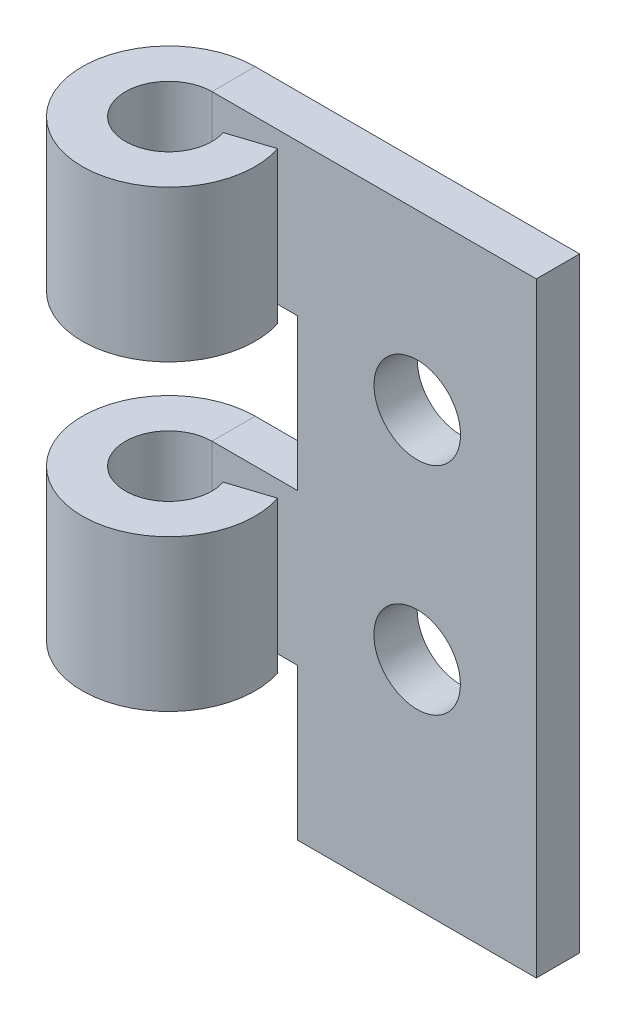
ISO-10303-21;
HEADER;
FILE_DESCRIPTION(('STEP AP214'),'2;1');
FILE_NAME('part.step','',(''),(''),'','','');
FILE_SCHEMA(('AUTOMOTIVE_DESIGN { 1 0 10303 214 1 1 1 1 }'));
ENDSEC;
DATA;
#1=APPLICATION_CONTEXT('core data for automotive mechanical design processes');
#2=APPLICATION_PROTOCOL_DEFINITION('international standard','automotive_design',2000,#1);
#3=PRODUCT_CONTEXT('',#1,'mechanical');
#4=PRODUCT('Part','Part','',(#3));
#5=PRODUCT_RELATED_PRODUCT_CATEGORY('part','',(#4));
#6=PRODUCT_DEFINITION_FORMATION('','',#4);
#7=PRODUCT_DEFINITION_CONTEXT('part definition',#1,'design');
#8=PRODUCT_DEFINITION('design','',#6,#7);
#9=PRODUCT_DEFINITION_SHAPE('','',#8);
#10=(LENGTH_UNIT() NAMED_UNIT(*) SI_UNIT(.MILLI.,.METRE.));
#11=(NAMED_UNIT(*) PLANE_ANGLE_UNIT() SI_UNIT($,.RADIAN.));
#12=(NAMED_UNIT(*) SI_UNIT($,.STERADIAN.) SOLID_ANGLE_UNIT());
#13=UNCERTAINTY_MEASURE_WITH_UNIT(LENGTH_MEASURE(1.E-05),#10,'distance_accuracy_value','');
#14=(GEOMETRIC_REPRESENTATION_CONTEXT(3) GLOBAL_UNCERTAINTY_ASSIGNED_CONTEXT((#13)) GLOBAL_UNIT_ASSIGNED_CONTEXT((#10,
#11,#12)) REPRESENTATION_CONTEXT('',''));
#15=CARTESIAN_POINT('',(0.,0.,0.));
#16=DIRECTION('',(0.,0.,1.));
#17=DIRECTION('',(1.,0.,0.));
#18=AXIS2_PLACEMENT_3D('',#15,#16,#17);
#19=CARTESIAN_POINT('',(-74.2525744057773,-0.875786914341309,1.));
#20=DIRECTION('',(-1.,0.,0.));
#21=DIRECTION('',(0.,0.,1.));
#22=AXIS2_PLACEMENT_3D('',#19,#20,#21);
#23=PLANE('',#22);
#24=DIRECTION('',(0.,1.,0.));
#25=VECTOR('',#24,1.);
#26=CARTESIAN_POINT('',(-74.2525744057773,-0.875786914341309,0.));
#27=LINE('',#26,#25);
#28=CARTESIAN_POINT('',(-74.2525744057773,-14.8757869143413,0.));
#29=VERTEX_POINT('',#28);
#30=CARTESIAN_POINT('',(-74.2525744057773,-0.875786914341309,0.));
#31=VERTEX_POINT('',#30);
#32=EDGE_CURVE('E106',#29,#31,#27,.T.);
#33=ORIENTED_EDGE('',*,*,#32,.T.);
#34=DIRECTION('',(0.,0.,-1.));
#35=VECTOR('',#34,1.);
#36=CARTESIAN_POINT('',(-74.2525744057773,-0.875786914341309,1.));
#37=LINE('',#36,#35);
#38=CARTESIAN_POINT('',(-74.2525744057773,-0.875786914341309,1.));
#39=VERTEX_POINT('',#38);
#40=EDGE_CURVE('E11',#39,#31,#37,.T.);
#41=ORIENTED_EDGE('',*,*,#40,.F.);
#42=DIRECTION('',(0.,1.,0.));
#43=VECTOR('',#42,1.);
#44=CARTESIAN_POINT('',(-74.2525744057773,-0.875786914341309,1.));
#45=LINE('',#44,#43);
#46=CARTESIAN_POINT('',(-74.2525744057773,-14.8757869143413,1.));
#47=VERTEX_POINT('',#46);
#48=EDGE_CURVE('E129',#47,#39,#45,.T.);
#49=ORIENTED_EDGE('',*,*,#48,.F.);
#50=DIRECTION('',(0.,0.,-1.));
#51=VECTOR('',#50,1.);
#52=CARTESIAN_POINT('',(-74.2525744057773,-14.8757869143413,1.));
#53=LINE('',#52,#51);
#54=EDGE_CURVE('E138',#47,#29,#53,.T.);
#55=ORIENTED_EDGE('',*,*,#54,.T.);
#56=EDGE_LOOP('',(#33,#41,#49,#55));
#57=FACE_BOUND('',#56,.T.);
#58=ADVANCED_FACE('F37',(#57),#23,.F.);
#59=CARTESIAN_POINT('',(-74.2525744057773,-0.875786914341309,1.));
#60=DIRECTION('',(0.,-1.,0.));
#61=DIRECTION('',(1.,0.,0.));
#62=AXIS2_PLACEMENT_3D('',#59,#60,#61);
#63=PLANE('',#62);
#64=DIRECTION('',(-1.,0.,0.));
#65=VECTOR('',#64,1.);
#66=CARTESIAN_POINT('',(-74.2525744057773,-0.875786914341309,0.));
#67=LINE('',#66,#65);
#68=CARTESIAN_POINT('',(-81.7525744057774,-0.87578691434131,0.));
#69=VERTEX_POINT('',#68);
#70=EDGE_CURVE('E65',#31,#69,#67,.T.);
#71=ORIENTED_EDGE('',*,*,#70,.T.);
#72=DIRECTION('',(0.,0.,-1.));
#73=VECTOR('',#72,1.);
#74=CARTESIAN_POINT('',(-81.7525744057774,-0.87578691434131,1.));
#75=LINE('',#74,#73);
#76=CARTESIAN_POINT('',(-81.7525744057774,-0.87578691434131,0.999999999999999));
#77=VERTEX_POINT('',#76);
#78=EDGE_CURVE('E45',#77,#69,#75,.T.);
#79=ORIENTED_EDGE('',*,*,#78,.F.);
#80=DIRECTION('',(-1.,0.,0.));
#81=VECTOR('',#80,1.);
#82=CARTESIAN_POINT('',(-74.2525744057773,-0.875786914341309,1.));
#83=LINE('',#82,#81);
#84=EDGE_CURVE('E131',#39,#77,#83,.T.);
#85=ORIENTED_EDGE('',*,*,#84,.F.);
#86=ORIENTED_EDGE('',*,*,#40,.T.);
#87=EDGE_LOOP('',(#71,#79,#85,#86));
#88=FACE_BOUND('',#87,.T.);
#89=ADVANCED_FACE('F324',(#88),#63,.F.);
#90=CARTESIAN_POINT('',(-74.2525744057773,-14.8757869143413,1.));
#91=DIRECTION('',(0.,1.,0.));
#92=DIRECTION('',(0.,0.,1.));
#93=AXIS2_PLACEMENT_3D('',#90,#91,#92);
#94=PLANE('',#93);
#95=DIRECTION('',(1.,0.,0.));
#96=VECTOR('',#95,1.);
#97=CARTESIAN_POINT('',(-74.2525744057773,-14.8757869143413,1.));
#98=LINE('',#97,#96);
#99=CARTESIAN_POINT('',(-79.7716026867718,-14.8757869143413,1.));
#100=VERTEX_POINT('',#99);
#101=EDGE_CURVE('E53',#100,#47,#98,.T.);
#102=ORIENTED_EDGE('',*,*,#101,.F.);
#103=DIRECTION('',(0.,0.,1.));
#104=VECTOR('',#103,1.);
#105=CARTESIAN_POINT('',(-79.7716026867718,-14.8757869143413,-0.00100000000000078));
#106=LINE('',#105,#104);
#107=CARTESIAN_POINT('',(-79.7716026867718,-14.8757869143413,0.));
#108=VERTEX_POINT('',#107);
#109=EDGE_CURVE('E166',#108,#100,#106,.T.);
#110=ORIENTED_EDGE('',*,*,#109,.F.);
#111=DIRECTION('',(1.,0.,0.));
#112=VECTOR('',#111,1.);
#113=CARTESIAN_POINT('',(-74.2525744057773,-14.8757869143413,0.));
#114=LINE('',#113,#112);
#115=EDGE_CURVE('E132',#108,#29,#114,.T.);
#116=ORIENTED_EDGE('',*,*,#115,.T.);
#117=ORIENTED_EDGE('',*,*,#54,.F.);
#118=EDGE_LOOP('',(#102,#110,#116,#117));
#119=FACE_BOUND('',#118,.T.);
#120=ADVANCED_FACE('F164',(#119),#94,.F.);
#121=CARTESIAN_POINT('',(0.,0.,1.));
#122=DIRECTION('',(0.,0.,-1.));
#123=DIRECTION('',(-1.,0.,0.));
#124=AXIS2_PLACEMENT_3D('',#121,#122,#123);
#125=PLANE('',#124);
#126=CARTESIAN_POINT('',(-77.0052927316337,-4.87578691434131,1.));
#127=DIRECTION('',(0.,0.,1.));
#128=DIRECTION('',(1.,0.,0.));
#129=AXIS2_PLACEMENT_3D('',#126,#127,#128);
#130=CIRCLE('',#129,0.999999999999998);
#131=CARTESIAN_POINT('',(-76.0052927316337,-4.87578691434131,1.));
#132=VERTEX_POINT('',#131);
#133=EDGE_CURVE('E251',#132,#132,#130,.T.);
#134=ORIENTED_EDGE('',*,*,#133,.F.);
#135=EDGE_LOOP('',(#134));
#136=FACE_BOUND('',#135,.T.);
#137=CARTESIAN_POINT('',(-77.0086906389541,-9.87578691434131,1.));
#138=DIRECTION('',(0.,0.,1.));
#139=DIRECTION('',(1.,0.,0.));
#140=AXIS2_PLACEMENT_3D('',#137,#138,#139);
#141=CIRCLE('',#140,0.999999999999998);
#142=CARTESIAN_POINT('',(-76.0086906389541,-9.87578691434131,1.));
#143=VERTEX_POINT('',#142);
#144=EDGE_CURVE('E549',#143,#143,#141,.T.);
#145=ORIENTED_EDGE('',*,*,#144,.F.);
#146=EDGE_LOOP('',(#145));
#147=FACE_BOUND('',#146,.T.);
#148=DIRECTION('',(0.,-1.,0.));
#149=VECTOR('',#148,1.);
#150=CARTESIAN_POINT('',(-81.7525744057774,-0.87578691434131,1.));
#151=LINE('',#150,#149);
#152=CARTESIAN_POINT('',(-81.7525744057774,-4.37578691434131,1.));
#153=VERTEX_POINT('',#152);
#154=EDGE_CURVE('E135',#77,#153,#151,.T.);
#155=ORIENTED_EDGE('',*,*,#154,.T.);
#156=DIRECTION('',(-1.,0.,0.));
#157=VECTOR('',#156,1.);
#158=CARTESIAN_POINT('',(-81.7525744057774,-4.37578691434131,1.));
#159=LINE('',#158,#157);
#160=CARTESIAN_POINT('',(-79.7716026867718,-4.37578691434131,1.));
#161=VERTEX_POINT('',#160);
#162=EDGE_CURVE('E240',#161,#153,#159,.T.);
#163=ORIENTED_EDGE('',*,*,#162,.F.);
#164=DIRECTION('',(0.,1.,0.));
#165=VECTOR('',#164,1.);
#166=CARTESIAN_POINT('',(-79.7716026867718,-4.37578691434131,1.));
#167=LINE('',#166,#165);
#168=CARTESIAN_POINT('',(-79.7716026867718,-7.87578691434131,1.));
#169=VERTEX_POINT('',#168);
#170=EDGE_CURVE('E233',#169,#161,#167,.T.);
#171=ORIENTED_EDGE('',*,*,#170,.F.);
#172=DIRECTION('',(1.,0.,0.));
#173=VECTOR('',#172,1.);
#174=CARTESIAN_POINT('',(-81.7525744057774,-7.87578691434131,1.));
#175=LINE('',#174,#173);
#176=CARTESIAN_POINT('',(-81.7525744057774,-7.87578691434131,1.));
#177=VERTEX_POINT('',#176);
#178=EDGE_CURVE('E230',#177,#169,#175,.T.);
#179=ORIENTED_EDGE('',*,*,#178,.F.);
#180=DIRECTION('',(0.,-1.,0.));
#181=VECTOR('',#180,1.);
#182=CARTESIAN_POINT('',(-81.7525744057774,-11.3757869143413,1.));
#183=LINE('',#182,#181);
#184=CARTESIAN_POINT('',(-81.7525744057774,-11.3757869143413,1.));
#185=VERTEX_POINT('',#184);
#186=EDGE_CURVE('E196',#185,#177,#183,.F.);
#187=ORIENTED_EDGE('',*,*,#186,.F.);
#188=DIRECTION('',(-1.,0.,0.));
#189=VECTOR('',#188,1.);
#190=CARTESIAN_POINT('',(-81.7525744057774,-11.3757869143413,1.));
#191=LINE('',#190,#189);
#192=CARTESIAN_POINT('',(-79.7716026867718,-11.3757869143413,1.));
#193=VERTEX_POINT('',#192);
#194=EDGE_CURVE('E171',#193,#185,#191,.T.);
#195=ORIENTED_EDGE('',*,*,#194,.F.);
#196=DIRECTION('',(0.,1.,0.));
#197=VECTOR('',#196,1.);
#198=CARTESIAN_POINT('',(-79.7716026867718,-11.3757869143413,1.));
#199=LINE('',#198,#197);
#200=EDGE_CURVE('E177',#100,#193,#199,.T.);
#201=ORIENTED_EDGE('',*,*,#200,.F.);
#202=ORIENTED_EDGE('',*,*,#101,.T.);
#203=ORIENTED_EDGE('',*,*,#48,.T.);
#204=ORIENTED_EDGE('',*,*,#84,.T.);
#205=EDGE_LOOP('',(#155,#163,#171,#179,#187,#195,#201,#202,#203,#204));
#206=FACE_BOUND('',#205,.T.);
#207=ADVANCED_FACE('F258',(#136,#147,#206),#125,.F.);
#208=CARTESIAN_POINT('',(0.,0.,0.));
#209=DIRECTION('',(0.,0.,-1.));
#210=DIRECTION('',(-1.,0.,0.));
#211=AXIS2_PLACEMENT_3D('',#208,#209,#210);
#212=PLANE('',#211);
#213=CARTESIAN_POINT('',(-77.0052927316337,-4.87578691434131,0.));
#214=DIRECTION('',(0.,0.,-1.));
#215=DIRECTION('',(-1.,0.,0.));
#216=AXIS2_PLACEMENT_3D('',#213,#214,#215);
#217=CIRCLE('',#216,0.999999999999998);
#218=CARTESIAN_POINT('',(-78.0052927316337,-4.87578691434131,0.));
#219=VERTEX_POINT('',#218);
#220=EDGE_CURVE('E545',#219,#219,#217,.F.);
#221=ORIENTED_EDGE('',*,*,#220,.T.);
#222=EDGE_LOOP('',(#221));
#223=FACE_BOUND('',#222,.T.);
#224=CARTESIAN_POINT('',(-77.0086906389541,-9.87578691434131,0.));
#225=DIRECTION('',(0.,0.,-1.));
#226=DIRECTION('',(-1.,0.,0.));
#227=AXIS2_PLACEMENT_3D('',#224,#225,#226);
#228=CIRCLE('',#227,0.999999999999998);
#229=CARTESIAN_POINT('',(-78.0086906389541,-9.87578691434131,0.));
#230=VERTEX_POINT('',#229);
#231=EDGE_CURVE('E553',#230,#230,#228,.F.);
#232=ORIENTED_EDGE('',*,*,#231,.T.);
#233=EDGE_LOOP('',(#232));
#234=FACE_BOUND('',#233,.T.);
#235=DIRECTION('',(-1.,0.,0.));
#236=VECTOR('',#235,1.);
#237=CARTESIAN_POINT('',(-81.7525744057774,-4.37578691434131,0.));
#238=LINE('',#237,#236);
#239=CARTESIAN_POINT('',(-79.7716026867718,-4.37578691434131,0.));
#240=VERTEX_POINT('',#239);
#241=CARTESIAN_POINT('',(-81.7525744057774,-4.37578691434131,0.));
#242=VERTEX_POINT('',#241);
#243=EDGE_CURVE('E224',#240,#242,#238,.T.);
#244=ORIENTED_EDGE('',*,*,#243,.T.);
#245=DIRECTION('',(0.,-1.,0.));
#246=VECTOR('',#245,1.);
#247=CARTESIAN_POINT('',(-81.7525744057774,-0.87578691434131,0.));
#248=LINE('',#247,#246);
#249=EDGE_CURVE('E142',#69,#242,#248,.T.);
#250=ORIENTED_EDGE('',*,*,#249,.F.);
#251=ORIENTED_EDGE('',*,*,#70,.F.);
#252=ORIENTED_EDGE('',*,*,#32,.F.);
#253=ORIENTED_EDGE('',*,*,#115,.F.);
#254=DIRECTION('',(0.,1.,0.));
#255=VECTOR('',#254,1.);
#256=CARTESIAN_POINT('',(-79.7716026867718,-11.3757869143413,0.));
#257=LINE('',#256,#255);
#258=CARTESIAN_POINT('',(-79.7716026867718,-11.3757869143413,0.));
#259=VERTEX_POINT('',#258);
#260=EDGE_CURVE('E159',#108,#259,#257,.T.);
#261=ORIENTED_EDGE('',*,*,#260,.T.);
#262=DIRECTION('',(-1.,0.,0.));
#263=VECTOR('',#262,1.);
#264=CARTESIAN_POINT('',(-81.7525744057774,-11.3757869143413,0.));
#265=LINE('',#264,#263);
#266=CARTESIAN_POINT('',(-81.7525744057774,-11.3757869143413,0.));
#267=VERTEX_POINT('',#266);
#268=EDGE_CURVE('E250',#259,#267,#265,.T.);
#269=ORIENTED_EDGE('',*,*,#268,.T.);
#270=DIRECTION('',(0.,-1.,0.));
#271=VECTOR('',#270,1.);
#272=CARTESIAN_POINT('',(-81.7525744057774,-11.3757869143413,0.));
#273=LINE('',#272,#271);
#274=CARTESIAN_POINT('',(-81.7525744057774,-7.87578691434131,0.));
#275=VERTEX_POINT('',#274);
#276=EDGE_CURVE('E180',#267,#275,#273,.F.);
#277=ORIENTED_EDGE('',*,*,#276,.T.);
#278=DIRECTION('',(1.,0.,0.));
#279=VECTOR('',#278,1.);
#280=CARTESIAN_POINT('',(-81.7525744057774,-7.87578691434131,0.));
#281=LINE('',#280,#279);
#282=CARTESIAN_POINT('',(-79.7716026867718,-7.87578691434131,0.));
#283=VERTEX_POINT('',#282);
#284=EDGE_CURVE('E205',#275,#283,#281,.T.);
#285=ORIENTED_EDGE('',*,*,#284,.T.);
#286=DIRECTION('',(0.,1.,0.));
#287=VECTOR('',#286,1.);
#288=CARTESIAN_POINT('',(-79.7716026867718,-4.37578691434131,0.));
#289=LINE('',#288,#287);
#290=EDGE_CURVE('E174',#283,#240,#289,.T.);
#291=ORIENTED_EDGE('',*,*,#290,.T.);
#292=EDGE_LOOP('',(#244,#250,#251,#252,#253,#261,#269,#277,#285,#291));
#293=FACE_BOUND('',#292,.T.);
#294=ADVANCED_FACE('F153',(#223,#234,#293),#212,.T.);
#295=CARTESIAN_POINT('',(-80.8015178894822,-2.62578691434131,1.69098300562504));
#296=DIRECTION('',(0.309016994374958,0.,0.95105651629515));
#297=DIRECTION('',(0.,-1.,0.));
#298=AXIS2_PLACEMENT_3D('',#295,#296,#297);
#299=PLANE('',#298);
#300=DIRECTION('',(0.95105651629515,0.,-0.309016994374958));
#301=VECTOR('',#300,1.);
#302=CARTESIAN_POINT('',(-80.8015178894822,-4.37578691434131,1.69098300562504));
#303=LINE('',#302,#301);
#304=CARTESIAN_POINT('',(-80.8015178894822,-4.37578691434131,1.69098300562504));
#305=VERTEX_POINT('',#304);
#306=CARTESIAN_POINT('',(-79.850461373187,-4.37578691434131,1.38196601125008));
#307=VERTEX_POINT('',#306);
#308=EDGE_CURVE('E95',#305,#307,#303,.T.);
#309=ORIENTED_EDGE('',*,*,#308,.F.);
#310=DIRECTION('',(0.,-1.,0.));
#311=VECTOR('',#310,1.);
#312=CARTESIAN_POINT('',(-80.8015178894822,-4.37578691434131,1.69098300562504));
#313=LINE('',#312,#311);
#314=CARTESIAN_POINT('',(-80.8015178894822,-0.87578691434131,1.69098300562504));
#315=VERTEX_POINT('',#314);
#316=EDGE_CURVE('E98',#315,#305,#313,.T.);
#317=ORIENTED_EDGE('',*,*,#316,.F.);
#318=DIRECTION('',(0.95105651629515,0.,-0.309016994374958));
#319=VECTOR('',#318,1.);
#320=CARTESIAN_POINT('',(-80.8015178894822,-0.87578691434131,1.69098300562504));
#321=LINE('',#320,#319);
#322=CARTESIAN_POINT('',(-79.850461373187,-0.87578691434131,1.38196601125008));
#323=VERTEX_POINT('',#322);
#324=EDGE_CURVE('E107',#315,#323,#321,.T.);
#325=ORIENTED_EDGE('',*,*,#324,.T.);
#326=DIRECTION('',(0.,-1.,0.));
#327=VECTOR('',#326,1.);
#328=CARTESIAN_POINT('',(-79.850461373187,-4.37578691434131,1.38196601125008));
#329=LINE('',#328,#327);
#330=EDGE_CURVE('E101',#323,#307,#329,.T.);
#331=ORIENTED_EDGE('',*,*,#330,.T.);
#332=EDGE_LOOP('',(#309,#317,#325,#331));
#333=FACE_BOUND('',#332,.T.);
#334=ADVANCED_FACE('F97',(#333),#299,.F.);
#335=CARTESIAN_POINT('',(-81.7525744057774,-0.87578691434131,2.));
#336=DIRECTION('',(0.,1.,0.));
#337=DIRECTION('',(0.,0.,1.));
#338=AXIS2_PLACEMENT_3D('',#335,#336,#337);
#339=PLANE('',#338);
#340=ORIENTED_EDGE('',*,*,#324,.F.);
#341=CARTESIAN_POINT('',(-81.7525744057774,-0.87578691434131,2.));
#342=DIRECTION('',(0.,-1.,0.));
#343=DIRECTION('',(0.,0.,-1.));
#344=AXIS2_PLACEMENT_3D('',#341,#342,#343);
#345=CIRCLE('',#344,1.);
#346=EDGE_CURVE('E115',#77,#315,#345,.F.);
#347=ORIENTED_EDGE('',*,*,#346,.F.);
#348=ORIENTED_EDGE('',*,*,#78,.T.);
#349=CARTESIAN_POINT('',(-81.7525744057774,-0.87578691434131,2.));
#350=DIRECTION('',(0.,-1.,0.));
#351=DIRECTION('',(0.,0.,-1.));
#352=AXIS2_PLACEMENT_3D('',#349,#350,#351);
#353=CIRCLE('',#352,2.);
#354=EDGE_CURVE('E128',#69,#323,#353,.F.);
#355=ORIENTED_EDGE('',*,*,#354,.T.);
#356=EDGE_LOOP('',(#340,#347,#348,#355));
#357=FACE_BOUND('',#356,.T.);
#358=ADVANCED_FACE('F342',(#357),#339,.T.);
#359=CARTESIAN_POINT('',(-81.7525744057774,-4.37578691434131,2.));
#360=DIRECTION('',(0.,1.,0.));
#361=DIRECTION('',(0.,0.,1.));
#362=AXIS2_PLACEMENT_3D('',#359,#360,#361);
#363=PLANE('',#362);
#364=CARTESIAN_POINT('',(-81.7525744057774,-4.37578691434131,2.));
#365=DIRECTION('',(0.,-1.,0.));
#366=DIRECTION('',(0.,0.,-1.));
#367=AXIS2_PLACEMENT_3D('',#364,#365,#366);
#368=CIRCLE('',#367,1.);
#369=EDGE_CURVE('E113',#305,#153,#368,.T.);
#370=ORIENTED_EDGE('',*,*,#369,.F.);
#371=ORIENTED_EDGE('',*,*,#308,.T.);
#372=CARTESIAN_POINT('',(-81.7525744057774,-4.37578691434131,2.));
#373=DIRECTION('',(0.,-1.,0.));
#374=DIRECTION('',(0.,0.,-1.));
#375=AXIS2_PLACEMENT_3D('',#372,#373,#374);
#376=CIRCLE('',#375,2.);
#377=EDGE_CURVE('E217',#307,#242,#376,.T.);
#378=ORIENTED_EDGE('',*,*,#377,.T.);
#379=DIRECTION('',(0.,0.,-1.));
#380=VECTOR('',#379,1.);
#381=CARTESIAN_POINT('',(-81.7525744057774,-4.37578691434131,0.999999999999999));
#382=LINE('',#381,#380);
#383=EDGE_CURVE('E121',#153,#242,#382,.T.);
#384=ORIENTED_EDGE('',*,*,#383,.F.);
#385=EDGE_LOOP('',(#370,#371,#378,#384));
#386=FACE_BOUND('',#385,.T.);
#387=ADVANCED_FACE('F119',(#386),#363,.F.);
#388=CARTESIAN_POINT('',(-81.7525744057774,-4.37578691434131,2.));
#389=DIRECTION('',(0.,-1.,0.));
#390=DIRECTION('',(0.95105651629515,0.,-0.309016994374958));
#391=AXIS2_PLACEMENT_3D('',#388,#389,#390);
#392=CYLINDRICAL_SURFACE('',#391,2.);
#393=ORIENTED_EDGE('',*,*,#249,.T.);
#394=ORIENTED_EDGE('',*,*,#377,.F.);
#395=ORIENTED_EDGE('',*,*,#330,.F.);
#396=ORIENTED_EDGE('',*,*,#354,.F.);
#397=EDGE_LOOP('',(#393,#394,#395,#396));
#398=FACE_BOUND('',#397,.T.);
#399=ADVANCED_FACE('F221',(#398),#392,.T.);
#400=CARTESIAN_POINT('',(-81.7525744057774,-4.37578691434131,2.));
#401=DIRECTION('',(0.,-1.,0.));
#402=DIRECTION('',(0.95105651629515,0.,-0.309016994374958));
#403=AXIS2_PLACEMENT_3D('',#400,#401,#402);
#404=CYLINDRICAL_SURFACE('',#403,1.);
#405=ORIENTED_EDGE('',*,*,#154,.F.);
#406=ORIENTED_EDGE('',*,*,#346,.T.);
#407=ORIENTED_EDGE('',*,*,#316,.T.);
#408=ORIENTED_EDGE('',*,*,#369,.T.);
#409=EDGE_LOOP('',(#405,#406,#407,#408));
#410=FACE_BOUND('',#409,.T.);
#411=ADVANCED_FACE('F111',(#410),#404,.F.);
#412=CARTESIAN_POINT('',(-80.8015178894822,-9.62578691434131,1.69098300562504));
#413=DIRECTION('',(0.309016994374959,0.,0.95105651629515));
#414=DIRECTION('',(0.,-1.,0.));
#415=AXIS2_PLACEMENT_3D('',#412,#413,#414);
#416=PLANE('',#415);
#417=DIRECTION('',(0.95105651629515,0.,-0.309016994374959));
#418=VECTOR('',#417,1.);
#419=CARTESIAN_POINT('',(-80.8015178894822,-11.3757869143413,1.69098300562504));
#420=LINE('',#419,#418);
#421=CARTESIAN_POINT('',(-80.8015178894822,-11.3757869143413,1.69098300562504));
#422=VERTEX_POINT('',#421);
#423=CARTESIAN_POINT('',(-79.850461373187,-11.3757869143413,1.38196601125008));
#424=VERTEX_POINT('',#423);
#425=EDGE_CURVE('E116',#422,#424,#420,.T.);
#426=ORIENTED_EDGE('',*,*,#425,.F.);
#427=DIRECTION('',(0.,-1.,0.));
#428=VECTOR('',#427,1.);
#429=CARTESIAN_POINT('',(-80.8015178894822,-11.3757869143413,1.69098300562504));
#430=LINE('',#429,#428);
#431=CARTESIAN_POINT('',(-80.8015178894822,-7.87578691434131,1.69098300562504));
#432=VERTEX_POINT('',#431);
#433=EDGE_CURVE('E202',#432,#422,#430,.T.);
#434=ORIENTED_EDGE('',*,*,#433,.F.);
#435=DIRECTION('',(0.95105651629515,0.,-0.309016994374959));
#436=VECTOR('',#435,1.);
#437=CARTESIAN_POINT('',(-80.8015178894822,-7.87578691434131,1.69098300562504));
#438=LINE('',#437,#436);
#439=CARTESIAN_POINT('',(-79.850461373187,-7.87578691434131,1.38196601125008));
#440=VERTEX_POINT('',#439);
#441=EDGE_CURVE('E209',#432,#440,#438,.T.);
#442=ORIENTED_EDGE('',*,*,#441,.T.);
#443=DIRECTION('',(0.,-1.,0.));
#444=VECTOR('',#443,1.);
#445=CARTESIAN_POINT('',(-79.850461373187,-11.3757869143413,1.38196601125008));
#446=LINE('',#445,#444);
#447=EDGE_CURVE('E188',#440,#424,#446,.T.);
#448=ORIENTED_EDGE('',*,*,#447,.T.);
#449=EDGE_LOOP('',(#426,#434,#442,#448));
#450=FACE_BOUND('',#449,.T.);
#451=ADVANCED_FACE('F281',(#450),#416,.F.);
#452=CARTESIAN_POINT('',(-81.7525744057774,-7.87578691434131,2.));
#453=DIRECTION('',(0.,1.,0.));
#454=DIRECTION('',(0.,0.,1.));
#455=AXIS2_PLACEMENT_3D('',#452,#453,#454);
#456=PLANE('',#455);
#457=ORIENTED_EDGE('',*,*,#441,.F.);
#458=CARTESIAN_POINT('',(-81.7525744057774,-7.87578691434131,2.));
#459=DIRECTION('',(0.,-1.,0.));
#460=DIRECTION('',(0.,0.,-1.));
#461=AXIS2_PLACEMENT_3D('',#458,#459,#460);
#462=CIRCLE('',#461,1.);
#463=EDGE_CURVE('E191',#177,#432,#462,.F.);
#464=ORIENTED_EDGE('',*,*,#463,.F.);
#465=DIRECTION('',(0.,0.,-1.));
#466=VECTOR('',#465,1.);
#467=CARTESIAN_POINT('',(-81.7525744057774,-7.87578691434131,1.));
#468=LINE('',#467,#466);
#469=EDGE_CURVE('E206',#177,#275,#468,.T.);
#470=ORIENTED_EDGE('',*,*,#469,.T.);
#471=CARTESIAN_POINT('',(-81.7525744057774,-7.87578691434131,2.));
#472=DIRECTION('',(0.,-1.,0.));
#473=DIRECTION('',(0.,0.,-1.));
#474=AXIS2_PLACEMENT_3D('',#471,#472,#473);
#475=CIRCLE('',#474,2.);
#476=EDGE_CURVE('E183',#275,#440,#475,.F.);
#477=ORIENTED_EDGE('',*,*,#476,.T.);
#478=EDGE_LOOP('',(#457,#464,#470,#477));
#479=FACE_BOUND('',#478,.T.);
#480=ADVANCED_FACE('F313',(#479),#456,.T.);
#481=CARTESIAN_POINT('',(-81.7525744057774,-11.3757869143413,2.));
#482=DIRECTION('',(0.,1.,0.));
#483=DIRECTION('',(0.,0.,1.));
#484=AXIS2_PLACEMENT_3D('',#481,#482,#483);
#485=PLANE('',#484);
#486=CARTESIAN_POINT('',(-81.7525744057774,-11.3757869143413,2.));
#487=DIRECTION('',(0.,-1.,0.));
#488=DIRECTION('',(0.,0.,-1.));
#489=AXIS2_PLACEMENT_3D('',#486,#487,#488);
#490=CIRCLE('',#489,1.);
#491=EDGE_CURVE('E199',#422,#185,#490,.T.);
#492=ORIENTED_EDGE('',*,*,#491,.F.);
#493=ORIENTED_EDGE('',*,*,#425,.T.);
#494=CARTESIAN_POINT('',(-81.7525744057774,-11.3757869143413,2.));
#495=DIRECTION('',(0.,-1.,0.));
#496=DIRECTION('',(0.,0.,-1.));
#497=AXIS2_PLACEMENT_3D('',#494,#495,#496);
#498=CIRCLE('',#497,2.);
#499=EDGE_CURVE('E184',#424,#267,#498,.T.);
#500=ORIENTED_EDGE('',*,*,#499,.T.);
#501=DIRECTION('',(0.,0.,-1.));
#502=VECTOR('',#501,1.);
#503=CARTESIAN_POINT('',(-81.7525744057774,-11.3757869143413,1.));
#504=LINE('',#503,#502);
#505=EDGE_CURVE('E187',#185,#267,#504,.T.);
#506=ORIENTED_EDGE('',*,*,#505,.F.);
#507=EDGE_LOOP('',(#492,#493,#500,#506));
#508=FACE_BOUND('',#507,.T.);
#509=ADVANCED_FACE('F270',(#508),#485,.F.);
#510=CARTESIAN_POINT('',(-81.7525744057774,-11.3757869143413,2.));
#511=DIRECTION('',(0.,-1.,0.));
#512=DIRECTION('',(0.95105651629515,0.,-0.309016994374959));
#513=AXIS2_PLACEMENT_3D('',#510,#511,#512);
#514=CYLINDRICAL_SURFACE('',#513,2.);
#515=ORIENTED_EDGE('',*,*,#276,.F.);
#516=ORIENTED_EDGE('',*,*,#499,.F.);
#517=ORIENTED_EDGE('',*,*,#447,.F.);
#518=ORIENTED_EDGE('',*,*,#476,.F.);
#519=EDGE_LOOP('',(#515,#516,#517,#518));
#520=FACE_BOUND('',#519,.T.);
#521=ADVANCED_FACE('F312',(#520),#514,.T.);
#522=CARTESIAN_POINT('',(-81.7525744057774,-11.3757869143413,2.));
#523=DIRECTION('',(0.,-1.,0.));
#524=DIRECTION('',(0.95105651629515,0.,-0.309016994374959));
#525=AXIS2_PLACEMENT_3D('',#522,#523,#524);
#526=CYLINDRICAL_SURFACE('',#525,1.);
#527=ORIENTED_EDGE('',*,*,#186,.T.);
#528=ORIENTED_EDGE('',*,*,#463,.T.);
#529=ORIENTED_EDGE('',*,*,#433,.T.);
#530=ORIENTED_EDGE('',*,*,#491,.T.);
#531=EDGE_LOOP('',(#527,#528,#529,#530));
#532=FACE_BOUND('',#531,.T.);
#533=ADVANCED_FACE('F274',(#532),#526,.F.);
#534=CARTESIAN_POINT('',(-81.7525744057774,-11.3757869143413,-0.00100000000000078));
#535=DIRECTION('',(0.,1.,0.));
#536=DIRECTION('',(0.,0.,1.));
#537=AXIS2_PLACEMENT_3D('',#534,#535,#536);
#538=PLANE('',#537);
#539=DIRECTION('',(0.,0.,1.));
#540=VECTOR('',#539,1.);
#541=CARTESIAN_POINT('',(-79.7716026867718,-11.3757869143413,-0.00100000000000078));
#542=LINE('',#541,#540);
#543=EDGE_CURVE('E170',#259,#193,#542,.T.);
#544=ORIENTED_EDGE('',*,*,#543,.T.);
#545=ORIENTED_EDGE('',*,*,#194,.T.);
#546=ORIENTED_EDGE('',*,*,#505,.T.);
#547=ORIENTED_EDGE('',*,*,#268,.F.);
#548=EDGE_LOOP('',(#544,#545,#546,#547));
#549=FACE_BOUND('',#548,.T.);
#550=ADVANCED_FACE('F263',(#549),#538,.F.);
#551=CARTESIAN_POINT('',(-79.7716026867718,-11.3757869143413,-0.00100000000000078));
#552=DIRECTION('',(1.,0.,0.));
#553=DIRECTION('',(0.,0.,-1.));
#554=AXIS2_PLACEMENT_3D('',#551,#552,#553);
#555=PLANE('',#554);
#556=ORIENTED_EDGE('',*,*,#109,.T.);
#557=ORIENTED_EDGE('',*,*,#200,.T.);
#558=ORIENTED_EDGE('',*,*,#543,.F.);
#559=ORIENTED_EDGE('',*,*,#260,.F.);
#560=EDGE_LOOP('',(#556,#557,#558,#559));
#561=FACE_BOUND('',#560,.T.);
#562=ADVANCED_FACE('F255',(#561),#555,.F.);
#563=CARTESIAN_POINT('',(-81.7525744057774,-4.37578691434131,-0.00100000000000078));
#564=DIRECTION('',(0.,1.,0.));
#565=DIRECTION('',(0.,0.,1.));
#566=AXIS2_PLACEMENT_3D('',#563,#564,#565);
#567=PLANE('',#566);
#568=DIRECTION('',(0.,0.,1.));
#569=VECTOR('',#568,1.);
#570=CARTESIAN_POINT('',(-79.7716026867718,-4.37578691434131,-0.00100000000000078));
#571=LINE('',#570,#569);
#572=EDGE_CURVE('E244',#240,#161,#571,.T.);
#573=ORIENTED_EDGE('',*,*,#572,.T.);
#574=ORIENTED_EDGE('',*,*,#162,.T.);
#575=ORIENTED_EDGE('',*,*,#383,.T.);
#576=ORIENTED_EDGE('',*,*,#243,.F.);
#577=EDGE_LOOP('',(#573,#574,#575,#576));
#578=FACE_BOUND('',#577,.T.);
#579=ADVANCED_FACE('F438',(#578),#567,.F.);
#580=CARTESIAN_POINT('',(-81.7525744057774,-7.87578691434131,-0.00100000000000078));
#581=DIRECTION('',(0.,-1.,0.));
#582=DIRECTION('',(0.,0.,-1.));
#583=AXIS2_PLACEMENT_3D('',#580,#581,#582);
#584=PLANE('',#583);
#585=ORIENTED_EDGE('',*,*,#469,.F.);
#586=ORIENTED_EDGE('',*,*,#178,.T.);
#587=DIRECTION('',(0.,0.,1.));
#588=VECTOR('',#587,1.);
#589=CARTESIAN_POINT('',(-79.7716026867718,-7.87578691434131,-0.00100000000000078));
#590=LINE('',#589,#588);
#591=EDGE_CURVE('E243',#283,#169,#590,.T.);
#592=ORIENTED_EDGE('',*,*,#591,.F.);
#593=ORIENTED_EDGE('',*,*,#284,.F.);
#594=EDGE_LOOP('',(#585,#586,#592,#593));
#595=FACE_BOUND('',#594,.T.);
#596=ADVANCED_FACE('F304',(#595),#584,.F.);
#597=CARTESIAN_POINT('',(-79.7716026867718,-4.37578691434131,-0.00100000000000078));
#598=DIRECTION('',(1.,0.,0.));
#599=DIRECTION('',(0.,0.,-1.));
#600=AXIS2_PLACEMENT_3D('',#597,#598,#599);
#601=PLANE('',#600);
#602=ORIENTED_EDGE('',*,*,#591,.T.);
#603=ORIENTED_EDGE('',*,*,#170,.T.);
#604=ORIENTED_EDGE('',*,*,#572,.F.);
#605=ORIENTED_EDGE('',*,*,#290,.F.);
#606=EDGE_LOOP('',(#602,#603,#604,#605));
#607=FACE_BOUND('',#606,.T.);
#608=ADVANCED_FACE('F310',(#607),#601,.F.);
#609=CARTESIAN_POINT('',(-77.0086906389541,-9.87578691434131,-0.00100000000000078));
#610=DIRECTION('',(0.,0.,1.));
#611=DIRECTION('',(1.,0.,0.));
#612=AXIS2_PLACEMENT_3D('',#609,#610,#611);
#613=CYLINDRICAL_SURFACE('',#612,0.999999999999998);
#614=ORIENTED_EDGE('',*,*,#231,.F.);
#615=EDGE_LOOP('',(#614));
#616=FACE_BOUND('',#615,.T.);
#617=ORIENTED_EDGE('',*,*,#144,.T.);
#618=EDGE_LOOP('',(#617));
#619=FACE_BOUND('',#618,.T.);
#620=ADVANCED_FACE('F463',(#616,#619),#613,.F.);
#621=CARTESIAN_POINT('',(-77.0052927316337,-4.87578691434131,-0.00100000000000078));
#622=DIRECTION('',(0.,0.,1.));
#623=DIRECTION('',(1.,0.,0.));
#624=AXIS2_PLACEMENT_3D('',#621,#622,#623);
#625=CYLINDRICAL_SURFACE('',#624,0.999999999999998);
#626=ORIENTED_EDGE('',*,*,#220,.F.);
#627=EDGE_LOOP('',(#626));
#628=FACE_BOUND('',#627,.T.);
#629=ORIENTED_EDGE('',*,*,#133,.T.);
#630=EDGE_LOOP('',(#629));
#631=FACE_BOUND('',#630,.T.);
#632=ADVANCED_FACE('F472',(#628,#631),#625,.F.);
#633=CLOSED_SHELL('',(#58,#89,#120,#207,#294,#334,#358,#387,#399,#411,#451,#480,#509,#521,#533,
#550,#562,#579,#596,#608,#620,#632));
#634=MANIFOLD_SOLID_BREP('B2',#633);
#635=ADVANCED_BREP_SHAPE_REPRESENTATION('',(#18,#634),#14);
#636=SHAPE_DEFINITION_REPRESENTATION(#9,#635);
ENDSEC;
END-ISO-10303-21;
